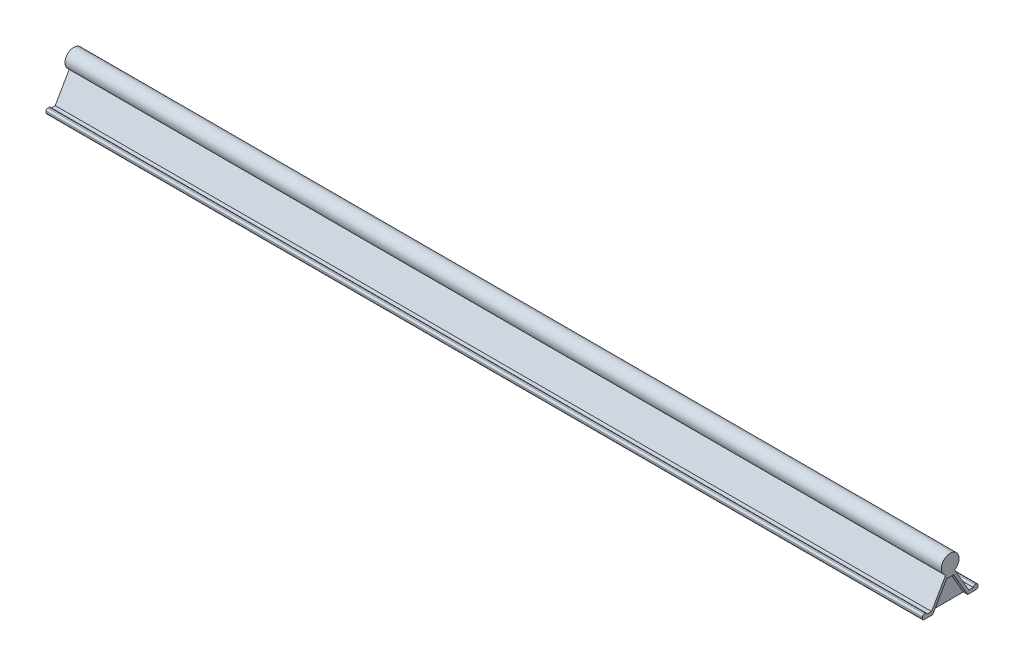
ISO-10303-21;
HEADER;
FILE_DESCRIPTION(('STEP AP214'),'2;1');
FILE_NAME('part.step','',(''),(''),'','','');
FILE_SCHEMA(('AUTOMOTIVE_DESIGN { 1 0 10303 214 1 1 1 1 }'));
ENDSEC;
DATA;
#1=APPLICATION_CONTEXT('core data for automotive mechanical design processes');
#2=APPLICATION_PROTOCOL_DEFINITION('international standard','automotive_design',2000,#1);
#3=PRODUCT_CONTEXT('',#1,'mechanical');
#4=PRODUCT('Part','Part','',(#3));
#5=PRODUCT_RELATED_PRODUCT_CATEGORY('part','',(#4));
#6=PRODUCT_DEFINITION_FORMATION('','',#4);
#7=PRODUCT_DEFINITION_CONTEXT('part definition',#1,'design');
#8=PRODUCT_DEFINITION('design','',#6,#7);
#9=PRODUCT_DEFINITION_SHAPE('','',#8);
#10=(LENGTH_UNIT() NAMED_UNIT(*) SI_UNIT(.MILLI.,.METRE.));
#11=(NAMED_UNIT(*) PLANE_ANGLE_UNIT() SI_UNIT($,.RADIAN.));
#12=(NAMED_UNIT(*) SI_UNIT($,.STERADIAN.) SOLID_ANGLE_UNIT());
#13=UNCERTAINTY_MEASURE_WITH_UNIT(LENGTH_MEASURE(1.E-05),#10,'distance_accuracy_value','');
#14=(GEOMETRIC_REPRESENTATION_CONTEXT(3) GLOBAL_UNCERTAINTY_ASSIGNED_CONTEXT((#13)) GLOBAL_UNIT_ASSIGNED_CONTEXT((#10,
#11,#12)) REPRESENTATION_CONTEXT('',''));
#15=CARTESIAN_POINT('',(0.,0.,0.));
#16=DIRECTION('',(0.,0.,1.));
#17=DIRECTION('',(1.,0.,0.));
#18=AXIS2_PLACEMENT_3D('',#15,#16,#17);
#19=CARTESIAN_POINT('',(1000.,0.,31.75));
#20=DIRECTION('',(0.,1.,0.));
#21=DIRECTION('',(0.,0.,1.));
#22=AXIS2_PLACEMENT_3D('',#19,#20,#21);
#23=PLANE('',#22);
#24=DIRECTION('',(0.,0.,-1.));
#25=VECTOR('',#24,1.);
#26=CARTESIAN_POINT('',(1000.,0.,31.75));
#27=LINE('',#26,#25);
#28=CARTESIAN_POINT('',(1000.,0.,29.75));
#29=VERTEX_POINT('',#28);
#30=CARTESIAN_POINT('',(1000.,0.,19.9994133247285));
#31=VERTEX_POINT('',#30);
#32=EDGE_CURVE('E289',#29,#31,#27,.T.);
#33=ORIENTED_EDGE('',*,*,#32,.F.);
#34=DIRECTION('',(-1.,0.,0.));
#35=VECTOR('',#34,1.);
#36=CARTESIAN_POINT('',(1000.,0.,29.75));
#37=LINE('',#36,#35);
#38=CARTESIAN_POINT('',(0.,0.,29.75));
#39=VERTEX_POINT('',#38);
#40=EDGE_CURVE('E348',#29,#39,#37,.T.);
#41=ORIENTED_EDGE('',*,*,#40,.T.);
#42=DIRECTION('',(0.,0.,-1.));
#43=VECTOR('',#42,1.);
#44=CARTESIAN_POINT('',(0.,0.,31.75));
#45=LINE('',#44,#43);
#46=CARTESIAN_POINT('',(0.,0.,19.9994133247285));
#47=VERTEX_POINT('',#46);
#48=EDGE_CURVE('E314',#39,#47,#45,.T.);
#49=ORIENTED_EDGE('',*,*,#48,.T.);
#50=DIRECTION('',(-1.,0.,0.));
#51=VECTOR('',#50,1.);
#52=CARTESIAN_POINT('',(5.,0.,19.9994133247285));
#53=LINE('',#52,#51);
#54=CARTESIAN_POINT('',(5.,0.,19.9994133247285));
#55=VERTEX_POINT('',#54);
#56=EDGE_CURVE('E272',#55,#47,#53,.T.);
#57=ORIENTED_EDGE('',*,*,#56,.F.);
#58=DIRECTION('',(0.,0.,1.));
#59=VECTOR('',#58,1.);
#60=CARTESIAN_POINT('',(5.,0.,0.));
#61=LINE('',#60,#59);
#62=CARTESIAN_POINT('',(5.,0.,-19.9994133247285));
#63=VERTEX_POINT('',#62);
#64=EDGE_CURVE('E256',#63,#55,#61,.T.);
#65=ORIENTED_EDGE('',*,*,#64,.F.);
#66=DIRECTION('',(-1.,0.,0.));
#67=VECTOR('',#66,1.);
#68=CARTESIAN_POINT('',(5.,0.,-19.9994133247285));
#69=LINE('',#68,#67);
#70=CARTESIAN_POINT('',(0.,0.,-19.9994133247285));
#71=VERTEX_POINT('',#70);
#72=EDGE_CURVE('E275',#63,#71,#69,.T.);
#73=ORIENTED_EDGE('',*,*,#72,.T.);
#74=CARTESIAN_POINT('',(0.,0.,-29.75));
#75=VERTEX_POINT('',#74);
#76=EDGE_CURVE('E313',#71,#75,#45,.T.);
#77=ORIENTED_EDGE('',*,*,#76,.T.);
#78=DIRECTION('',(-1.,0.,0.));
#79=VECTOR('',#78,1.);
#80=CARTESIAN_POINT('',(1000.,0.,-29.75));
#81=LINE('',#80,#79);
#82=CARTESIAN_POINT('',(1000.,0.,-29.75));
#83=VERTEX_POINT('',#82);
#84=EDGE_CURVE('E346',#75,#83,#81,.F.);
#85=ORIENTED_EDGE('',*,*,#84,.T.);
#86=CARTESIAN_POINT('',(1000.,0.,-19.9994133247285));
#87=VERTEX_POINT('',#86);
#88=EDGE_CURVE('E288',#87,#83,#27,.T.);
#89=ORIENTED_EDGE('',*,*,#88,.F.);
#90=DIRECTION('',(1.,0.,0.));
#91=VECTOR('',#90,1.);
#92=CARTESIAN_POINT('',(995.,0.,-19.9994133247285));
#93=LINE('',#92,#91);
#94=CARTESIAN_POINT('',(995.,0.,-19.9994133247285));
#95=VERTEX_POINT('',#94);
#96=EDGE_CURVE('E246',#95,#87,#93,.T.);
#97=ORIENTED_EDGE('',*,*,#96,.F.);
#98=DIRECTION('',(0.,0.,1.));
#99=VECTOR('',#98,1.);
#100=CARTESIAN_POINT('',(995.,0.,0.));
#101=LINE('',#100,#99);
#102=CARTESIAN_POINT('',(995.,0.,19.9994133247285));
#103=VERTEX_POINT('',#102);
#104=EDGE_CURVE('E229',#95,#103,#101,.T.);
#105=ORIENTED_EDGE('',*,*,#104,.T.);
#106=DIRECTION('',(1.,0.,0.));
#107=VECTOR('',#106,1.);
#108=CARTESIAN_POINT('',(995.,0.,19.9994133247285));
#109=LINE('',#108,#107);
#110=EDGE_CURVE('E219',#103,#31,#109,.T.);
#111=ORIENTED_EDGE('',*,*,#110,.T.);
#112=EDGE_LOOP('',(#33,#41,#49,#57,#65,#73,#77,#85,#89,#97,#105,#111));
#113=FACE_BOUND('',#112,.T.);
#114=ADVANCED_FACE('F47',(#113),#23,.F.);
#115=CARTESIAN_POINT('',(1000.,40.64,0.));
#116=DIRECTION('',(1.,0.,0.));
#117=DIRECTION('',(0.,0.,-1.));
#118=AXIS2_PLACEMENT_3D('',#115,#116,#117);
#119=PLANE('',#118);
#120=DIRECTION('',(0.,-1.,0.));
#121=VECTOR('',#120,1.);
#122=CARTESIAN_POINT('',(1000.,5.588,31.75));
#123=LINE('',#122,#121);
#124=CARTESIAN_POINT('',(1000.,3.588,31.75));
#125=VERTEX_POINT('',#124);
#126=CARTESIAN_POINT('',(1000.,2.,31.75));
#127=VERTEX_POINT('',#126);
#128=EDGE_CURVE('E285',#125,#127,#123,.T.);
#129=ORIENTED_EDGE('',*,*,#128,.T.);
#130=CARTESIAN_POINT('',(1000.,2.,29.75));
#131=DIRECTION('',(1.,0.,0.));
#132=DIRECTION('',(0.,0.,-1.));
#133=AXIS2_PLACEMENT_3D('',#130,#131,#132);
#134=CIRCLE('',#133,2.);
#135=EDGE_CURVE('E377',#127,#29,#134,.T.);
#136=ORIENTED_EDGE('',*,*,#135,.T.);
#137=ORIENTED_EDGE('',*,*,#32,.T.);
#138=DIRECTION('',(0.,-0.866025403784438,0.500000000000001));
#139=VECTOR('',#138,1.);
#140=CARTESIAN_POINT('',(1000.,8.65999999999996,14.9995599935464));
#141=LINE('',#140,#139);
#142=CARTESIAN_POINT('',(1000.,28.0431896474707,3.80867023282553));
#143=VERTEX_POINT('',#142);
#144=EDGE_CURVE('E236',#143,#31,#141,.T.);
#145=ORIENTED_EDGE('',*,*,#144,.F.);
#146=CARTESIAN_POINT('',(1000.,40.64,0.));
#147=DIRECTION('',(-1.,0.,0.));
#148=DIRECTION('',(0.,0.,1.));
#149=AXIS2_PLACEMENT_3D('',#146,#147,#148);
#150=CIRCLE('',#149,13.16);
#151=CARTESIAN_POINT('',(1000.,28.0431896474707,-3.80867023282564));
#152=VERTEX_POINT('',#151);
#153=EDGE_CURVE('E215',#152,#143,#150,.T.);
#154=ORIENTED_EDGE('',*,*,#153,.F.);
#155=DIRECTION('',(0.,-0.86602540378444,-0.499999999999998));
#156=VECTOR('',#155,1.);
#157=CARTESIAN_POINT('',(1000.,8.65999999999991,-14.9995599935464));
#158=LINE('',#157,#156);
#159=EDGE_CURVE('E233',#152,#87,#158,.T.);
#160=ORIENTED_EDGE('',*,*,#159,.T.);
#161=ORIENTED_EDGE('',*,*,#88,.T.);
#162=CARTESIAN_POINT('',(1000.,2.,-29.75));
#163=DIRECTION('',(1.,0.,0.));
#164=DIRECTION('',(0.,0.,-1.));
#165=AXIS2_PLACEMENT_3D('',#162,#163,#164);
#166=CIRCLE('',#165,2.);
#167=CARTESIAN_POINT('',(1000.,2.,-31.75));
#168=VERTEX_POINT('',#167);
#169=EDGE_CURVE('E372',#83,#168,#166,.T.);
#170=ORIENTED_EDGE('',*,*,#169,.T.);
#171=DIRECTION('',(0.,1.,0.));
#172=VECTOR('',#171,1.);
#173=CARTESIAN_POINT('',(1000.,5.588,-31.75));
#174=LINE('',#173,#172);
#175=CARTESIAN_POINT('',(1000.,3.588,-31.75));
#176=VERTEX_POINT('',#175);
#177=EDGE_CURVE('E291',#168,#176,#174,.T.);
#178=ORIENTED_EDGE('',*,*,#177,.T.);
#179=CARTESIAN_POINT('',(1000.,3.588,-29.75));
#180=DIRECTION('',(1.,0.,0.));
#181=DIRECTION('',(0.,0.,-1.));
#182=AXIS2_PLACEMENT_3D('',#179,#180,#181);
#183=CIRCLE('',#182,2.);
#184=CARTESIAN_POINT('',(1000.,5.588,-29.75));
#185=VERTEX_POINT('',#184);
#186=EDGE_CURVE('E370',#176,#185,#183,.T.);
#187=ORIENTED_EDGE('',*,*,#186,.T.);
#188=DIRECTION('',(0.,0.,1.));
#189=VECTOR('',#188,1.);
#190=CARTESIAN_POINT('',(1000.,5.588,-26.3438104142538));
#191=LINE('',#190,#189);
#192=CARTESIAN_POINT('',(1000.,5.588,-28.3314512268756));
#193=VERTEX_POINT('',#192);
#194=EDGE_CURVE('E294',#185,#193,#191,.T.);
#195=ORIENTED_EDGE('',*,*,#194,.T.);
#196=CARTESIAN_POINT('',(1000.,3.588,-28.3314512268756));
#197=DIRECTION('',(1.,0.,0.));
#198=DIRECTION('',(0.,0.,-1.));
#199=AXIS2_PLACEMENT_3D('',#196,#197,#198);
#200=CIRCLE('',#199,2.);
#201=CARTESIAN_POINT('',(1000.,3.81,-26.3438104142538));
#202=VERTEX_POINT('',#201);
#203=EDGE_CURVE('E368',#193,#202,#200,.T.);
#204=ORIENTED_EDGE('',*,*,#203,.T.);
#205=DIRECTION('',(0.,0.,1.));
#206=VECTOR('',#205,1.);
#207=CARTESIAN_POINT('',(1000.,3.81,-21.2638104142538));
#208=LINE('',#207,#206);
#209=CARTESIAN_POINT('',(1000.,3.81,-21.2638104142538));
#210=VERTEX_POINT('',#209);
#211=EDGE_CURVE('E297',#202,#210,#208,.T.);
#212=ORIENTED_EDGE('',*,*,#211,.T.);
#213=DIRECTION('',(0.,0.86602540378444,0.499999999999998));
#214=VECTOR('',#213,1.);
#215=CARTESIAN_POINT('',(1000.,31.8411818975501,-5.07999999999998));
#216=LINE('',#215,#214);
#217=CARTESIAN_POINT('',(1000.,31.8411818975501,-5.07999999999998));
#218=VERTEX_POINT('',#217);
#219=EDGE_CURVE('E299',#210,#218,#216,.T.);
#220=ORIENTED_EDGE('',*,*,#219,.T.);
#221=CARTESIAN_POINT('',(1000.,40.64,0.));
#222=DIRECTION('',(1.,0.,0.));
#223=DIRECTION('',(0.,0.,-1.));
#224=AXIS2_PLACEMENT_3D('',#221,#222,#223);
#225=CIRCLE('',#224,10.16);
#226=CARTESIAN_POINT('',(1000.,31.8411818975501,5.07999999999998));
#227=VERTEX_POINT('',#226);
#228=EDGE_CURVE('E301',#218,#227,#225,.T.);
#229=ORIENTED_EDGE('',*,*,#228,.T.);
#230=DIRECTION('',(0.,-0.86602540378444,0.499999999999998));
#231=VECTOR('',#230,1.);
#232=CARTESIAN_POINT('',(1000.,3.81,21.2638104142538));
#233=LINE('',#232,#231);
#234=CARTESIAN_POINT('',(1000.,3.81,21.2638104142538));
#235=VERTEX_POINT('',#234);
#236=EDGE_CURVE('E303',#227,#235,#233,.T.);
#237=ORIENTED_EDGE('',*,*,#236,.T.);
#238=DIRECTION('',(0.,0.,1.));
#239=VECTOR('',#238,1.);
#240=CARTESIAN_POINT('',(1000.,3.81,21.2638104142538));
#241=LINE('',#240,#239);
#242=CARTESIAN_POINT('',(1000.,3.81,26.3438104142538));
#243=VERTEX_POINT('',#242);
#244=EDGE_CURVE('E280',#235,#243,#241,.T.);
#245=ORIENTED_EDGE('',*,*,#244,.T.);
#246=CARTESIAN_POINT('',(1000.,3.588,28.3314512268756));
#247=DIRECTION('',(1.,0.,0.));
#248=DIRECTION('',(0.,0.,-1.));
#249=AXIS2_PLACEMENT_3D('',#246,#247,#248);
#250=CIRCLE('',#249,2.);
#251=CARTESIAN_POINT('',(1000.,5.588,28.3314512268756));
#252=VERTEX_POINT('',#251);
#253=EDGE_CURVE('E69',#243,#252,#250,.T.);
#254=ORIENTED_EDGE('',*,*,#253,.T.);
#255=DIRECTION('',(0.,0.,1.));
#256=VECTOR('',#255,1.);
#257=CARTESIAN_POINT('',(1000.,5.588,26.3438104142538));
#258=LINE('',#257,#256);
#259=CARTESIAN_POINT('',(1000.,5.588,29.75));
#260=VERTEX_POINT('',#259);
#261=EDGE_CURVE('E282',#252,#260,#258,.T.);
#262=ORIENTED_EDGE('',*,*,#261,.T.);
#263=CARTESIAN_POINT('',(1000.,3.588,29.75));
#264=DIRECTION('',(1.,0.,0.));
#265=DIRECTION('',(0.,0.,-1.));
#266=AXIS2_PLACEMENT_3D('',#263,#264,#265);
#267=CIRCLE('',#266,2.);
#268=EDGE_CURVE('E374',#260,#125,#267,.T.);
#269=ORIENTED_EDGE('',*,*,#268,.T.);
#270=EDGE_LOOP('',(#129,#136,#137,#145,#154,#160,#161,#170,#178,#187,#195,#204,#212,#220,#229,
#237,#245,#254,#262,#269));
#271=FACE_BOUND('',#270,.T.);
#272=ADVANCED_FACE('F395',(#271),#119,.T.);
#273=CARTESIAN_POINT('',(0.,40.64,0.));
#274=DIRECTION('',(1.,0.,0.));
#275=DIRECTION('',(0.,0.,-1.));
#276=AXIS2_PLACEMENT_3D('',#273,#274,#275);
#277=PLANE('',#276);
#278=ORIENTED_EDGE('',*,*,#48,.F.);
#279=CARTESIAN_POINT('',(0.,2.,29.75));
#280=DIRECTION('',(1.,0.,0.));
#281=DIRECTION('',(0.,0.,-1.));
#282=AXIS2_PLACEMENT_3D('',#279,#280,#281);
#283=CIRCLE('',#282,2.);
#284=CARTESIAN_POINT('',(0.,2.,31.75));
#285=VERTEX_POINT('',#284);
#286=EDGE_CURVE('E361',#39,#285,#283,.F.);
#287=ORIENTED_EDGE('',*,*,#286,.T.);
#288=DIRECTION('',(0.,-1.,0.));
#289=VECTOR('',#288,1.);
#290=CARTESIAN_POINT('',(0.,5.588,31.75));
#291=LINE('',#290,#289);
#292=CARTESIAN_POINT('',(0.,3.588,31.75));
#293=VERTEX_POINT('',#292);
#294=EDGE_CURVE('E310',#293,#285,#291,.T.);
#295=ORIENTED_EDGE('',*,*,#294,.F.);
#296=CARTESIAN_POINT('',(0.,3.588,29.75));
#297=DIRECTION('',(1.,0.,0.));
#298=DIRECTION('',(0.,0.,-1.));
#299=AXIS2_PLACEMENT_3D('',#296,#297,#298);
#300=CIRCLE('',#299,2.);
#301=CARTESIAN_POINT('',(0.,5.588,29.75));
#302=VERTEX_POINT('',#301);
#303=EDGE_CURVE('E357',#293,#302,#300,.F.);
#304=ORIENTED_EDGE('',*,*,#303,.T.);
#305=DIRECTION('',(0.,0.,1.));
#306=VECTOR('',#305,1.);
#307=CARTESIAN_POINT('',(0.,5.588,26.3438104142538));
#308=LINE('',#307,#306);
#309=CARTESIAN_POINT('',(0.,5.588,28.3314512268756));
#310=VERTEX_POINT('',#309);
#311=EDGE_CURVE('E308',#310,#302,#308,.T.);
#312=ORIENTED_EDGE('',*,*,#311,.F.);
#313=CARTESIAN_POINT('',(0.,3.588,28.3314512268756));
#314=DIRECTION('',(1.,0.,0.));
#315=DIRECTION('',(0.,0.,-1.));
#316=AXIS2_PLACEMENT_3D('',#313,#314,#315);
#317=CIRCLE('',#316,2.);
#318=CARTESIAN_POINT('',(0.,3.81,26.3438104142538));
#319=VERTEX_POINT('',#318);
#320=EDGE_CURVE('E359',#310,#319,#317,.F.);
#321=ORIENTED_EDGE('',*,*,#320,.T.);
#322=DIRECTION('',(0.,0.,1.));
#323=VECTOR('',#322,1.);
#324=CARTESIAN_POINT('',(0.,3.81,21.2638104142538));
#325=LINE('',#324,#323);
#326=CARTESIAN_POINT('',(0.,3.81,21.2638104142538));
#327=VERTEX_POINT('',#326);
#328=EDGE_CURVE('E271',#327,#319,#325,.T.);
#329=ORIENTED_EDGE('',*,*,#328,.F.);
#330=DIRECTION('',(0.,-0.86602540378444,0.499999999999998));
#331=VECTOR('',#330,1.);
#332=CARTESIAN_POINT('',(0.,3.81,21.2638104142538));
#333=LINE('',#332,#331);
#334=CARTESIAN_POINT('',(0.,31.8411818975501,5.07999999999998));
#335=VERTEX_POINT('',#334);
#336=EDGE_CURVE('E283',#335,#327,#333,.T.);
#337=ORIENTED_EDGE('',*,*,#336,.F.);
#338=CARTESIAN_POINT('',(0.,40.64,0.));
#339=DIRECTION('',(1.,0.,0.));
#340=DIRECTION('',(0.,0.,-1.));
#341=AXIS2_PLACEMENT_3D('',#338,#339,#340);
#342=CIRCLE('',#341,10.16);
#343=CARTESIAN_POINT('',(0.,31.8411818975501,-5.07999999999998));
#344=VERTEX_POINT('',#343);
#345=EDGE_CURVE('E326',#344,#335,#342,.T.);
#346=ORIENTED_EDGE('',*,*,#345,.F.);
#347=DIRECTION('',(0.,0.86602540378444,0.499999999999998));
#348=VECTOR('',#347,1.);
#349=CARTESIAN_POINT('',(0.,31.8411818975501,-5.07999999999998));
#350=LINE('',#349,#348);
#351=CARTESIAN_POINT('',(0.,3.81,-21.2638104142538));
#352=VERTEX_POINT('',#351);
#353=EDGE_CURVE('E324',#352,#344,#350,.T.);
#354=ORIENTED_EDGE('',*,*,#353,.F.);
#355=DIRECTION('',(0.,0.,1.));
#356=VECTOR('',#355,1.);
#357=CARTESIAN_POINT('',(0.,3.81,-21.2638104142538));
#358=LINE('',#357,#356);
#359=CARTESIAN_POINT('',(0.,3.81,-26.3438104142538));
#360=VERTEX_POINT('',#359);
#361=EDGE_CURVE('E322',#360,#352,#358,.T.);
#362=ORIENTED_EDGE('',*,*,#361,.F.);
#363=CARTESIAN_POINT('',(0.,3.588,-28.3314512268756));
#364=DIRECTION('',(1.,0.,0.));
#365=DIRECTION('',(0.,0.,-1.));
#366=AXIS2_PLACEMENT_3D('',#363,#364,#365);
#367=CIRCLE('',#366,2.);
#368=CARTESIAN_POINT('',(0.,5.588,-28.3314512268756));
#369=VERTEX_POINT('',#368);
#370=EDGE_CURVE('E351',#360,#369,#367,.F.);
#371=ORIENTED_EDGE('',*,*,#370,.T.);
#372=DIRECTION('',(0.,0.,1.));
#373=VECTOR('',#372,1.);
#374=CARTESIAN_POINT('',(0.,5.588,-26.3438104142538));
#375=LINE('',#374,#373);
#376=CARTESIAN_POINT('',(0.,5.588,-29.75));
#377=VERTEX_POINT('',#376);
#378=EDGE_CURVE('E319',#377,#369,#375,.T.);
#379=ORIENTED_EDGE('',*,*,#378,.F.);
#380=CARTESIAN_POINT('',(0.,3.588,-29.75));
#381=DIRECTION('',(1.,0.,0.));
#382=DIRECTION('',(0.,0.,-1.));
#383=AXIS2_PLACEMENT_3D('',#380,#381,#382);
#384=CIRCLE('',#383,2.);
#385=CARTESIAN_POINT('',(0.,3.588,-31.75));
#386=VERTEX_POINT('',#385);
#387=EDGE_CURVE('E353',#377,#386,#384,.F.);
#388=ORIENTED_EDGE('',*,*,#387,.T.);
#389=DIRECTION('',(0.,1.,0.));
#390=VECTOR('',#389,1.);
#391=CARTESIAN_POINT('',(0.,5.588,-31.75));
#392=LINE('',#391,#390);
#393=CARTESIAN_POINT('',(0.,2.,-31.75));
#394=VERTEX_POINT('',#393);
#395=EDGE_CURVE('E316',#394,#386,#392,.T.);
#396=ORIENTED_EDGE('',*,*,#395,.F.);
#397=CARTESIAN_POINT('',(0.,2.,-29.75));
#398=DIRECTION('',(1.,0.,0.));
#399=DIRECTION('',(0.,0.,-1.));
#400=AXIS2_PLACEMENT_3D('',#397,#398,#399);
#401=CIRCLE('',#400,2.);
#402=EDGE_CURVE('E355',#394,#75,#401,.F.);
#403=ORIENTED_EDGE('',*,*,#402,.T.);
#404=ORIENTED_EDGE('',*,*,#76,.F.);
#405=DIRECTION('',(0.,-0.86602540378444,-0.499999999999998));
#406=VECTOR('',#405,1.);
#407=CARTESIAN_POINT('',(0.,8.65999999999991,-14.9995599935464));
#408=LINE('',#407,#406);
#409=CARTESIAN_POINT('',(0.,28.0431896474707,-3.80867023282563));
#410=VERTEX_POINT('',#409);
#411=EDGE_CURVE('E264',#410,#71,#408,.T.);
#412=ORIENTED_EDGE('',*,*,#411,.F.);
#413=CARTESIAN_POINT('',(0.,40.64,0.));
#414=DIRECTION('',(-1.,0.,0.));
#415=DIRECTION('',(0.,0.,1.));
#416=AXIS2_PLACEMENT_3D('',#413,#414,#415);
#417=CIRCLE('',#416,13.16);
#418=CARTESIAN_POINT('',(0.,28.0431896474707,3.80867023282564));
#419=VERTEX_POINT('',#418);
#420=EDGE_CURVE('E245',#410,#419,#417,.T.);
#421=ORIENTED_EDGE('',*,*,#420,.T.);
#422=DIRECTION('',(0.,-0.866025403784438,0.500000000000001));
#423=VECTOR('',#422,1.);
#424=CARTESIAN_POINT('',(0.,8.65999999999996,14.9995599935464));
#425=LINE('',#424,#423);
#426=EDGE_CURVE('E253',#419,#47,#425,.T.);
#427=ORIENTED_EDGE('',*,*,#426,.T.);
#428=EDGE_LOOP('',(#278,#287,#295,#304,#312,#321,#329,#337,#346,#354,#362,#371,#379,#388,#396,
#403,#404,#412,#421,#427));
#429=FACE_BOUND('',#428,.T.);
#430=ADVANCED_FACE('F406',(#429),#277,.F.);
#431=CARTESIAN_POINT('',(1000.,3.81,21.2638104142538));
#432=DIRECTION('',(0.,-1.,0.));
#433=DIRECTION('',(0.,0.,-1.));
#434=AXIS2_PLACEMENT_3D('',#431,#432,#433);
#435=PLANE('',#434);
#436=ORIENTED_EDGE('',*,*,#328,.T.);
#437=DIRECTION('',(-1.,0.,0.));
#438=VECTOR('',#437,1.);
#439=CARTESIAN_POINT('',(1000.,3.81,26.3438104142538));
#440=LINE('',#439,#438);
#441=EDGE_CURVE('E343',#243,#319,#440,.T.);
#442=ORIENTED_EDGE('',*,*,#441,.F.);
#443=ORIENTED_EDGE('',*,*,#244,.F.);
#444=DIRECTION('',(-1.,0.,0.));
#445=VECTOR('',#444,1.);
#446=CARTESIAN_POINT('',(1000.,3.81,21.2638104142538));
#447=LINE('',#446,#445);
#448=EDGE_CURVE('E305',#235,#327,#447,.T.);
#449=ORIENTED_EDGE('',*,*,#448,.T.);
#450=EDGE_LOOP('',(#436,#442,#443,#449));
#451=FACE_BOUND('',#450,.T.);
#452=ADVANCED_FACE('F425',(#451),#435,.F.);
#453=CARTESIAN_POINT('',(1000.,5.588,26.3438104142538));
#454=DIRECTION('',(0.,-1.,0.));
#455=DIRECTION('',(0.,0.,-1.));
#456=AXIS2_PLACEMENT_3D('',#453,#454,#455);
#457=PLANE('',#456);
#458=ORIENTED_EDGE('',*,*,#261,.F.);
#459=DIRECTION('',(1.,0.,0.));
#460=VECTOR('',#459,1.);
#461=CARTESIAN_POINT('',(1000.,5.588,28.3314512268756));
#462=LINE('',#461,#460);
#463=EDGE_CURVE('E380',#252,#310,#462,.F.);
#464=ORIENTED_EDGE('',*,*,#463,.T.);
#465=ORIENTED_EDGE('',*,*,#311,.T.);
#466=DIRECTION('',(-1.,0.,0.));
#467=VECTOR('',#466,1.);
#468=CARTESIAN_POINT('',(1000.,5.588,29.75));
#469=LINE('',#468,#467);
#470=EDGE_CURVE('E62',#302,#260,#469,.F.);
#471=ORIENTED_EDGE('',*,*,#470,.T.);
#472=EDGE_LOOP('',(#458,#464,#465,#471));
#473=FACE_BOUND('',#472,.T.);
#474=ADVANCED_FACE('F430',(#473),#457,.F.);
#475=CARTESIAN_POINT('',(1000.,5.588,31.75));
#476=DIRECTION('',(0.,0.,-1.));
#477=DIRECTION('',(-1.,0.,0.));
#478=AXIS2_PLACEMENT_3D('',#475,#476,#477);
#479=PLANE('',#478);
#480=ORIENTED_EDGE('',*,*,#294,.T.);
#481=DIRECTION('',(-1.,0.,0.));
#482=VECTOR('',#481,1.);
#483=CARTESIAN_POINT('',(1000.,2.,31.75));
#484=LINE('',#483,#482);
#485=EDGE_CURVE('E366',#285,#127,#484,.F.);
#486=ORIENTED_EDGE('',*,*,#485,.T.);
#487=ORIENTED_EDGE('',*,*,#128,.F.);
#488=DIRECTION('',(-1.,0.,0.));
#489=VECTOR('',#488,1.);
#490=CARTESIAN_POINT('',(1000.,3.588,31.75));
#491=LINE('',#490,#489);
#492=EDGE_CURVE('E363',#125,#293,#491,.T.);
#493=ORIENTED_EDGE('',*,*,#492,.T.);
#494=EDGE_LOOP('',(#480,#486,#487,#493));
#495=FACE_BOUND('',#494,.T.);
#496=ADVANCED_FACE('F438',(#495),#479,.F.);
#497=CARTESIAN_POINT('',(1000.,5.588,-31.75));
#498=DIRECTION('',(0.,0.,1.));
#499=DIRECTION('',(1.,0.,0.));
#500=AXIS2_PLACEMENT_3D('',#497,#498,#499);
#501=PLANE('',#500);
#502=ORIENTED_EDGE('',*,*,#177,.F.);
#503=DIRECTION('',(-1.,0.,0.));
#504=VECTOR('',#503,1.);
#505=CARTESIAN_POINT('',(1000.,2.,-31.75));
#506=LINE('',#505,#504);
#507=EDGE_CURVE('E385',#168,#394,#506,.T.);
#508=ORIENTED_EDGE('',*,*,#507,.T.);
#509=ORIENTED_EDGE('',*,*,#395,.T.);
#510=DIRECTION('',(-1.,0.,0.));
#511=VECTOR('',#510,1.);
#512=CARTESIAN_POINT('',(1000.,3.588,-31.75));
#513=LINE('',#512,#511);
#514=EDGE_CURVE('E383',#386,#176,#513,.F.);
#515=ORIENTED_EDGE('',*,*,#514,.T.);
#516=EDGE_LOOP('',(#502,#508,#509,#515));
#517=FACE_BOUND('',#516,.T.);
#518=ADVANCED_FACE('F470',(#517),#501,.F.);
#519=CARTESIAN_POINT('',(1000.,5.588,-26.3438104142538));
#520=DIRECTION('',(0.,-1.,0.));
#521=DIRECTION('',(0.,0.,-1.));
#522=AXIS2_PLACEMENT_3D('',#519,#520,#521);
#523=PLANE('',#522);
#524=ORIENTED_EDGE('',*,*,#194,.F.);
#525=DIRECTION('',(-1.,0.,0.));
#526=VECTOR('',#525,1.);
#527=CARTESIAN_POINT('',(1000.,5.588,-29.75));
#528=LINE('',#527,#526);
#529=EDGE_CURVE('E11',#185,#377,#528,.T.);
#530=ORIENTED_EDGE('',*,*,#529,.T.);
#531=ORIENTED_EDGE('',*,*,#378,.T.);
#532=DIRECTION('',(-1.,0.,0.));
#533=VECTOR('',#532,1.);
#534=CARTESIAN_POINT('',(1000.,5.588,-28.3314512268756));
#535=LINE('',#534,#533);
#536=EDGE_CURVE('E55',#369,#193,#535,.F.);
#537=ORIENTED_EDGE('',*,*,#536,.T.);
#538=EDGE_LOOP('',(#524,#530,#531,#537));
#539=FACE_BOUND('',#538,.T.);
#540=ADVANCED_FACE('F390',(#539),#523,.F.);
#541=CARTESIAN_POINT('',(1000.,3.81,-21.2638104142538));
#542=DIRECTION('',(0.,-1.,0.));
#543=DIRECTION('',(0.,0.,-1.));
#544=AXIS2_PLACEMENT_3D('',#541,#542,#543);
#545=PLANE('',#544);
#546=ORIENTED_EDGE('',*,*,#361,.T.);
#547=DIRECTION('',(-1.,0.,0.));
#548=VECTOR('',#547,1.);
#549=CARTESIAN_POINT('',(1000.,3.81,-21.2638104142538));
#550=LINE('',#549,#548);
#551=EDGE_CURVE('E337',#210,#352,#550,.T.);
#552=ORIENTED_EDGE('',*,*,#551,.F.);
#553=ORIENTED_EDGE('',*,*,#211,.F.);
#554=DIRECTION('',(-1.,0.,0.));
#555=VECTOR('',#554,1.);
#556=CARTESIAN_POINT('',(1000.,3.81,-26.3438104142538));
#557=LINE('',#556,#555);
#558=EDGE_CURVE('E340',#202,#360,#557,.T.);
#559=ORIENTED_EDGE('',*,*,#558,.T.);
#560=EDGE_LOOP('',(#546,#552,#553,#559));
#561=FACE_BOUND('',#560,.T.);
#562=ADVANCED_FACE('F401',(#561),#545,.F.);
#563=CARTESIAN_POINT('',(1000.,31.8411818975501,-5.07999999999998));
#564=DIRECTION('',(0.,-0.499999999999998,0.86602540378444));
#565=DIRECTION('',(0.,-0.86602540378444,-0.499999999999998));
#566=AXIS2_PLACEMENT_3D('',#563,#564,#565);
#567=PLANE('',#566);
#568=ORIENTED_EDGE('',*,*,#353,.T.);
#569=DIRECTION('',(-1.,0.,0.));
#570=VECTOR('',#569,1.);
#571=CARTESIAN_POINT('',(1000.,31.8411818975501,-5.07999999999998));
#572=LINE('',#571,#570);
#573=EDGE_CURVE('E334',#218,#344,#572,.T.);
#574=ORIENTED_EDGE('',*,*,#573,.F.);
#575=ORIENTED_EDGE('',*,*,#219,.F.);
#576=ORIENTED_EDGE('',*,*,#551,.T.);
#577=EDGE_LOOP('',(#568,#574,#575,#576));
#578=FACE_BOUND('',#577,.T.);
#579=ADVANCED_FACE('F411',(#578),#567,.F.);
#580=CARTESIAN_POINT('',(1000.,40.64,0.));
#581=DIRECTION('',(-1.,0.,0.));
#582=DIRECTION('',(0.,0.,1.));
#583=AXIS2_PLACEMENT_3D('',#580,#581,#582);
#584=CYLINDRICAL_SURFACE('',#583,10.16);
#585=ORIENTED_EDGE('',*,*,#345,.T.);
#586=DIRECTION('',(-1.,0.,0.));
#587=VECTOR('',#586,1.);
#588=CARTESIAN_POINT('',(1000.,31.8411818975501,5.07999999999998));
#589=LINE('',#588,#587);
#590=EDGE_CURVE('E331',#227,#335,#589,.T.);
#591=ORIENTED_EDGE('',*,*,#590,.F.);
#592=ORIENTED_EDGE('',*,*,#228,.F.);
#593=ORIENTED_EDGE('',*,*,#573,.T.);
#594=EDGE_LOOP('',(#585,#591,#592,#593));
#595=FACE_BOUND('',#594,.T.);
#596=ADVANCED_FACE('F415',(#595),#584,.T.);
#597=CARTESIAN_POINT('',(1000.,3.81,21.2638104142538));
#598=DIRECTION('',(0.,-0.499999999999998,-0.86602540378444));
#599=DIRECTION('',(0.,0.86602540378444,-0.499999999999998));
#600=AXIS2_PLACEMENT_3D('',#597,#598,#599);
#601=PLANE('',#600);
#602=ORIENTED_EDGE('',*,*,#336,.T.);
#603=ORIENTED_EDGE('',*,*,#448,.F.);
#604=ORIENTED_EDGE('',*,*,#236,.F.);
#605=ORIENTED_EDGE('',*,*,#590,.T.);
#606=EDGE_LOOP('',(#602,#603,#604,#605));
#607=FACE_BOUND('',#606,.T.);
#608=ADVANCED_FACE('F422',(#607),#601,.F.);
#609=CARTESIAN_POINT('',(5.,40.64,0.));
#610=DIRECTION('',(-1.,0.,0.));
#611=DIRECTION('',(0.,0.,1.));
#612=AXIS2_PLACEMENT_3D('',#609,#610,#611);
#613=CYLINDRICAL_SURFACE('',#612,13.16);
#614=ORIENTED_EDGE('',*,*,#420,.F.);
#615=DIRECTION('',(-1.,0.,0.));
#616=VECTOR('',#615,1.);
#617=CARTESIAN_POINT('',(5.,28.0431896474707,-3.80867023282564));
#618=LINE('',#617,#616);
#619=CARTESIAN_POINT('',(5.,28.0431896474707,-3.80867023282564));
#620=VERTEX_POINT('',#619);
#621=EDGE_CURVE('E261',#620,#410,#618,.T.);
#622=ORIENTED_EDGE('',*,*,#621,.F.);
#623=CARTESIAN_POINT('',(5.,40.64,0.));
#624=DIRECTION('',(-1.,0.,0.));
#625=DIRECTION('',(0.,0.,1.));
#626=AXIS2_PLACEMENT_3D('',#623,#624,#625);
#627=CIRCLE('',#626,13.16);
#628=CARTESIAN_POINT('',(5.,28.0431896474707,3.80867023282564));
#629=VERTEX_POINT('',#628);
#630=EDGE_CURVE('E249',#620,#629,#627,.T.);
#631=ORIENTED_EDGE('',*,*,#630,.T.);
#632=DIRECTION('',(-1.,0.,0.));
#633=VECTOR('',#632,1.);
#634=CARTESIAN_POINT('',(5.,28.0431896474707,3.80867023282564));
#635=LINE('',#634,#633);
#636=EDGE_CURVE('E268',#629,#419,#635,.T.);
#637=ORIENTED_EDGE('',*,*,#636,.T.);
#638=EDGE_LOOP('',(#614,#622,#631,#637));
#639=FACE_BOUND('',#638,.T.);
#640=ADVANCED_FACE('F452',(#639),#613,.T.);
#641=CARTESIAN_POINT('',(5.,8.65999999999996,14.9995599935464));
#642=DIRECTION('',(0.,-0.500000000000001,-0.866025403784438));
#643=DIRECTION('',(0.,0.866025403784438,-0.500000000000001));
#644=AXIS2_PLACEMENT_3D('',#641,#642,#643);
#645=PLANE('',#644);
#646=ORIENTED_EDGE('',*,*,#426,.F.);
#647=ORIENTED_EDGE('',*,*,#636,.F.);
#648=DIRECTION('',(0.,-0.866025403784438,0.500000000000001));
#649=VECTOR('',#648,1.);
#650=CARTESIAN_POINT('',(5.,8.65999999999996,14.9995599935464));
#651=LINE('',#650,#649);
#652=EDGE_CURVE('E259',#629,#55,#651,.T.);
#653=ORIENTED_EDGE('',*,*,#652,.T.);
#654=ORIENTED_EDGE('',*,*,#56,.T.);
#655=EDGE_LOOP('',(#646,#647,#653,#654));
#656=FACE_BOUND('',#655,.T.);
#657=ADVANCED_FACE('F450',(#656),#645,.T.);
#658=CARTESIAN_POINT('',(5.,8.65999999999991,-14.9995599935464));
#659=DIRECTION('',(0.,0.499999999999998,-0.86602540378444));
#660=DIRECTION('',(0.,0.86602540378444,0.499999999999998));
#661=AXIS2_PLACEMENT_3D('',#658,#659,#660);
#662=PLANE('',#661);
#663=ORIENTED_EDGE('',*,*,#411,.T.);
#664=ORIENTED_EDGE('',*,*,#72,.F.);
#665=DIRECTION('',(0.,-0.86602540378444,-0.499999999999998));
#666=VECTOR('',#665,1.);
#667=CARTESIAN_POINT('',(5.,8.65999999999991,-14.9995599935464));
#668=LINE('',#667,#666);
#669=EDGE_CURVE('E252',#620,#63,#668,.T.);
#670=ORIENTED_EDGE('',*,*,#669,.F.);
#671=ORIENTED_EDGE('',*,*,#621,.T.);
#672=EDGE_LOOP('',(#663,#664,#670,#671));
#673=FACE_BOUND('',#672,.T.);
#674=ADVANCED_FACE('F459',(#673),#662,.F.);
#675=CARTESIAN_POINT('',(5.,0.,0.));
#676=DIRECTION('',(-1.,0.,0.));
#677=DIRECTION('',(0.,0.,1.));
#678=AXIS2_PLACEMENT_3D('',#675,#676,#677);
#679=PLANE('',#678);
#680=ORIENTED_EDGE('',*,*,#630,.F.);
#681=ORIENTED_EDGE('',*,*,#669,.T.);
#682=ORIENTED_EDGE('',*,*,#64,.T.);
#683=ORIENTED_EDGE('',*,*,#652,.F.);
#684=EDGE_LOOP('',(#680,#681,#682,#683));
#685=FACE_BOUND('',#684,.T.);
#686=ADVANCED_FACE('F456',(#685),#679,.T.);
#687=CARTESIAN_POINT('',(995.,40.64,0.));
#688=DIRECTION('',(1.,0.,0.));
#689=DIRECTION('',(0.,0.,-1.));
#690=AXIS2_PLACEMENT_3D('',#687,#688,#689);
#691=CYLINDRICAL_SURFACE('',#690,13.16);
#692=ORIENTED_EDGE('',*,*,#153,.T.);
#693=DIRECTION('',(1.,0.,0.));
#694=VECTOR('',#693,1.);
#695=CARTESIAN_POINT('',(995.,28.0431896474707,3.80867023282564));
#696=LINE('',#695,#694);
#697=CARTESIAN_POINT('',(995.,28.0431896474707,3.80867023282564));
#698=VERTEX_POINT('',#697);
#699=EDGE_CURVE('E209',#698,#143,#696,.T.);
#700=ORIENTED_EDGE('',*,*,#699,.F.);
#701=CARTESIAN_POINT('',(995.,40.64,0.));
#702=DIRECTION('',(-1.,0.,0.));
#703=DIRECTION('',(0.,0.,1.));
#704=AXIS2_PLACEMENT_3D('',#701,#702,#703);
#705=CIRCLE('',#704,13.16);
#706=CARTESIAN_POINT('',(995.,28.0431896474707,-3.80867023282564));
#707=VERTEX_POINT('',#706);
#708=EDGE_CURVE('E213',#707,#698,#705,.T.);
#709=ORIENTED_EDGE('',*,*,#708,.F.);
#710=DIRECTION('',(1.,0.,0.));
#711=VECTOR('',#710,1.);
#712=CARTESIAN_POINT('',(995.,28.0431896474707,-3.80867023282564));
#713=LINE('',#712,#711);
#714=EDGE_CURVE('E243',#707,#152,#713,.T.);
#715=ORIENTED_EDGE('',*,*,#714,.T.);
#716=EDGE_LOOP('',(#692,#700,#709,#715));
#717=FACE_BOUND('',#716,.T.);
#718=ADVANCED_FACE('F211',(#717),#691,.T.);
#719=CARTESIAN_POINT('',(995.,8.65999999999991,-14.9995599935464));
#720=DIRECTION('',(0.,-0.499999999999998,0.86602540378444));
#721=DIRECTION('',(0.,-0.86602540378444,-0.499999999999998));
#722=AXIS2_PLACEMENT_3D('',#719,#720,#721);
#723=PLANE('',#722);
#724=ORIENTED_EDGE('',*,*,#159,.F.);
#725=ORIENTED_EDGE('',*,*,#714,.F.);
#726=DIRECTION('',(0.,-0.86602540378444,-0.499999999999998));
#727=VECTOR('',#726,1.);
#728=CARTESIAN_POINT('',(995.,8.65999999999991,-14.9995599935464));
#729=LINE('',#728,#727);
#730=EDGE_CURVE('E220',#707,#95,#729,.T.);
#731=ORIENTED_EDGE('',*,*,#730,.T.);
#732=ORIENTED_EDGE('',*,*,#96,.T.);
#733=EDGE_LOOP('',(#724,#725,#731,#732));
#734=FACE_BOUND('',#733,.T.);
#735=ADVANCED_FACE('F575',(#734),#723,.T.);
#736=CARTESIAN_POINT('',(995.,8.65999999999996,14.9995599935464));
#737=DIRECTION('',(0.,0.500000000000001,0.866025403784438));
#738=DIRECTION('',(0.,-0.866025403784438,0.500000000000001));
#739=AXIS2_PLACEMENT_3D('',#736,#737,#738);
#740=PLANE('',#739);
#741=ORIENTED_EDGE('',*,*,#144,.T.);
#742=ORIENTED_EDGE('',*,*,#110,.F.);
#743=DIRECTION('',(0.,-0.866025403784438,0.500000000000001));
#744=VECTOR('',#743,1.);
#745=CARTESIAN_POINT('',(995.,8.65999999999996,14.9995599935464));
#746=LINE('',#745,#744);
#747=EDGE_CURVE('E223',#698,#103,#746,.T.);
#748=ORIENTED_EDGE('',*,*,#747,.F.);
#749=ORIENTED_EDGE('',*,*,#699,.T.);
#750=EDGE_LOOP('',(#741,#742,#748,#749));
#751=FACE_BOUND('',#750,.T.);
#752=ADVANCED_FACE('F224',(#751),#740,.F.);
#753=CARTESIAN_POINT('',(995.,0.,0.));
#754=DIRECTION('',(1.,0.,0.));
#755=DIRECTION('',(0.,0.,1.));
#756=AXIS2_PLACEMENT_3D('',#753,#754,#755);
#757=PLANE('',#756);
#758=ORIENTED_EDGE('',*,*,#708,.T.);
#759=ORIENTED_EDGE('',*,*,#747,.T.);
#760=ORIENTED_EDGE('',*,*,#104,.F.);
#761=ORIENTED_EDGE('',*,*,#730,.F.);
#762=EDGE_LOOP('',(#758,#759,#760,#761));
#763=FACE_BOUND('',#762,.T.);
#764=ADVANCED_FACE('F232',(#763),#757,.T.);
#765=CARTESIAN_POINT('',(1000.,2.,29.75));
#766=DIRECTION('',(-1.,0.,0.));
#767=DIRECTION('',(0.,0.,1.));
#768=AXIS2_PLACEMENT_3D('',#765,#766,#767);
#769=CYLINDRICAL_SURFACE('',#768,2.);
#770=ORIENTED_EDGE('',*,*,#135,.F.);
#771=ORIENTED_EDGE('',*,*,#485,.F.);
#772=ORIENTED_EDGE('',*,*,#286,.F.);
#773=ORIENTED_EDGE('',*,*,#40,.F.);
#774=EDGE_LOOP('',(#770,#771,#772,#773));
#775=FACE_BOUND('',#774,.T.);
#776=ADVANCED_FACE('F444',(#775),#769,.T.);
#777=CARTESIAN_POINT('',(1000.,3.588,28.3314512268756));
#778=DIRECTION('',(1.,0.,0.));
#779=DIRECTION('',(0.,0.,-1.));
#780=AXIS2_PLACEMENT_3D('',#777,#778,#779);
#781=CYLINDRICAL_SURFACE('',#780,2.);
#782=ORIENTED_EDGE('',*,*,#253,.F.);
#783=ORIENTED_EDGE('',*,*,#441,.T.);
#784=ORIENTED_EDGE('',*,*,#320,.F.);
#785=ORIENTED_EDGE('',*,*,#463,.F.);
#786=EDGE_LOOP('',(#782,#783,#784,#785));
#787=FACE_BOUND('',#786,.T.);
#788=ADVANCED_FACE('F428',(#787),#781,.T.);
#789=CARTESIAN_POINT('',(1000.,3.588,29.75));
#790=DIRECTION('',(-1.,0.,0.));
#791=DIRECTION('',(0.,0.,1.));
#792=AXIS2_PLACEMENT_3D('',#789,#790,#791);
#793=CYLINDRICAL_SURFACE('',#792,2.);
#794=ORIENTED_EDGE('',*,*,#268,.F.);
#795=ORIENTED_EDGE('',*,*,#470,.F.);
#796=ORIENTED_EDGE('',*,*,#303,.F.);
#797=ORIENTED_EDGE('',*,*,#492,.F.);
#798=EDGE_LOOP('',(#794,#795,#796,#797));
#799=FACE_BOUND('',#798,.T.);
#800=ADVANCED_FACE('F435',(#799),#793,.T.);
#801=CARTESIAN_POINT('',(1000.,2.,-29.75));
#802=DIRECTION('',(-1.,0.,0.));
#803=DIRECTION('',(0.,0.,1.));
#804=AXIS2_PLACEMENT_3D('',#801,#802,#803);
#805=CYLINDRICAL_SURFACE('',#804,2.);
#806=ORIENTED_EDGE('',*,*,#169,.F.);
#807=ORIENTED_EDGE('',*,*,#84,.F.);
#808=ORIENTED_EDGE('',*,*,#402,.F.);
#809=ORIENTED_EDGE('',*,*,#507,.F.);
#810=EDGE_LOOP('',(#806,#807,#808,#809));
#811=FACE_BOUND('',#810,.T.);
#812=ADVANCED_FACE('F467',(#811),#805,.T.);
#813=CARTESIAN_POINT('',(1000.,3.588,-29.75));
#814=DIRECTION('',(-1.,0.,0.));
#815=DIRECTION('',(0.,0.,1.));
#816=AXIS2_PLACEMENT_3D('',#813,#814,#815);
#817=CYLINDRICAL_SURFACE('',#816,2.);
#818=ORIENTED_EDGE('',*,*,#186,.F.);
#819=ORIENTED_EDGE('',*,*,#514,.F.);
#820=ORIENTED_EDGE('',*,*,#387,.F.);
#821=ORIENTED_EDGE('',*,*,#529,.F.);
#822=EDGE_LOOP('',(#818,#819,#820,#821));
#823=FACE_BOUND('',#822,.T.);
#824=ADVANCED_FACE('F474',(#823),#817,.T.);
#825=CARTESIAN_POINT('',(1000.,3.588,-28.3314512268756));
#826=DIRECTION('',(-1.,0.,0.));
#827=DIRECTION('',(0.,0.,1.));
#828=AXIS2_PLACEMENT_3D('',#825,#826,#827);
#829=CYLINDRICAL_SURFACE('',#828,2.);
#830=ORIENTED_EDGE('',*,*,#203,.F.);
#831=ORIENTED_EDGE('',*,*,#536,.F.);
#832=ORIENTED_EDGE('',*,*,#370,.F.);
#833=ORIENTED_EDGE('',*,*,#558,.F.);
#834=EDGE_LOOP('',(#830,#831,#832,#833));
#835=FACE_BOUND('',#834,.T.);
#836=ADVANCED_FACE('F49',(#835),#829,.T.);
#837=CLOSED_SHELL('',(#114,#272,#430,#452,#474,#496,#518,#540,#562,#579,#596,#608,#640,#657,
#674,#686,#718,#735,#752,#764,#776,#788,#800,#812,#824,#836));
#838=MANIFOLD_SOLID_BREP('B2',#837);
#839=ADVANCED_BREP_SHAPE_REPRESENTATION('',(#18,#838),#14);
#840=SHAPE_DEFINITION_REPRESENTATION(#9,#839);
ENDSEC;
END-ISO-10303-21;
